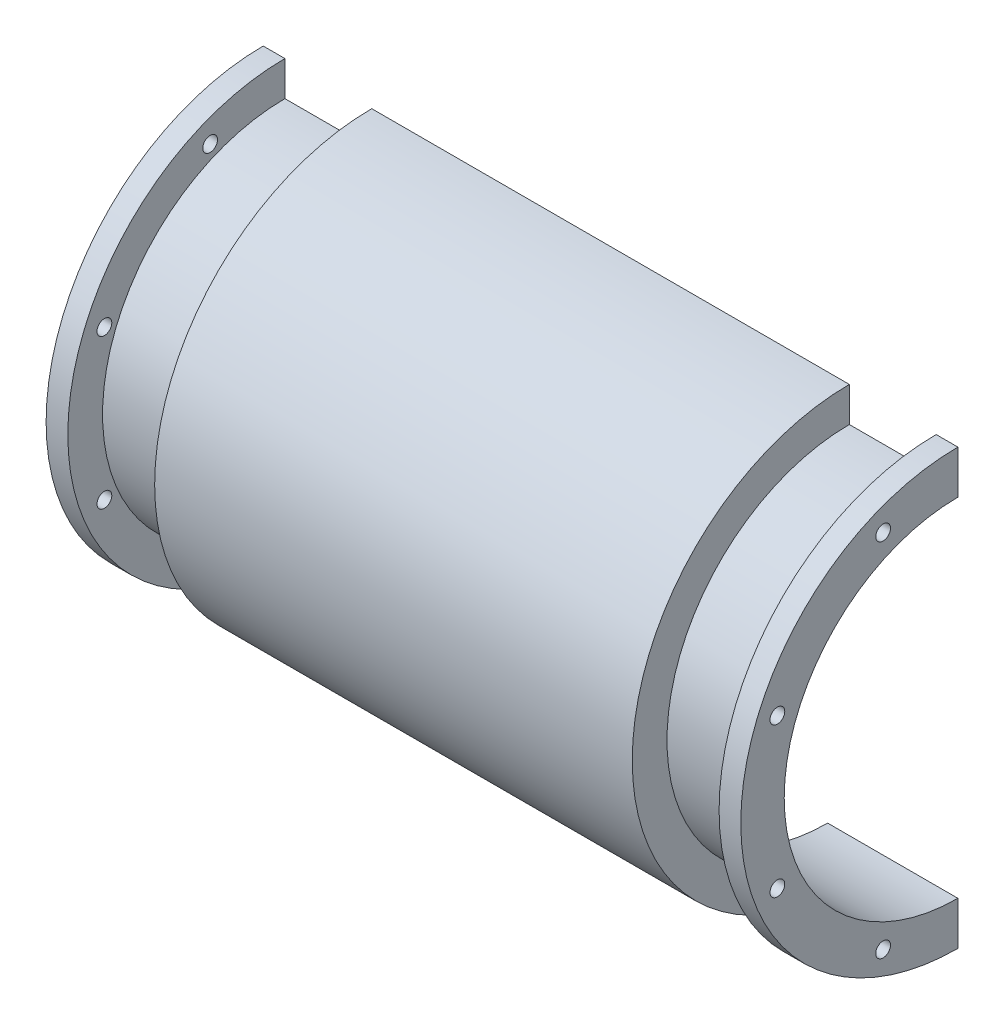
ISO-10303-21;
HEADER;
FILE_DESCRIPTION(('STEP AP214'),'2;1');
FILE_NAME('part.step','',(''),(''),'','','');
FILE_SCHEMA(('AUTOMOTIVE_DESIGN { 1 0 10303 214 1 1 1 1 }'));
ENDSEC;
DATA;
#1=APPLICATION_CONTEXT('core data for automotive mechanical design processes');
#2=APPLICATION_PROTOCOL_DEFINITION('international standard','automotive_design',2000,#1);
#3=PRODUCT_CONTEXT('',#1,'mechanical');
#4=PRODUCT('Part','Part','',(#3));
#5=PRODUCT_RELATED_PRODUCT_CATEGORY('part','',(#4));
#6=PRODUCT_DEFINITION_FORMATION('','',#4);
#7=PRODUCT_DEFINITION_CONTEXT('part definition',#1,'design');
#8=PRODUCT_DEFINITION('design','',#6,#7);
#9=PRODUCT_DEFINITION_SHAPE('','',#8);
#10=(LENGTH_UNIT() NAMED_UNIT(*) SI_UNIT(.MILLI.,.METRE.));
#11=(NAMED_UNIT(*) PLANE_ANGLE_UNIT() SI_UNIT($,.RADIAN.));
#12=(NAMED_UNIT(*) SI_UNIT($,.STERADIAN.) SOLID_ANGLE_UNIT());
#13=UNCERTAINTY_MEASURE_WITH_UNIT(LENGTH_MEASURE(1.E-05),#10,'distance_accuracy_value','');
#14=(GEOMETRIC_REPRESENTATION_CONTEXT(3) GLOBAL_UNCERTAINTY_ASSIGNED_CONTEXT((#13)) GLOBAL_UNIT_ASSIGNED_CONTEXT((#10,
#11,#12)) REPRESENTATION_CONTEXT('',''));
#15=CARTESIAN_POINT('',(0.,0.,0.));
#16=DIRECTION('',(0.,0.,1.));
#17=DIRECTION('',(1.,0.,0.));
#18=AXIS2_PLACEMENT_3D('',#15,#16,#17);
#19=CARTESIAN_POINT('',(80.,-40.,-2.79318507107451E-13));
#20=DIRECTION('',(-1.,0.,0.));
#21=DIRECTION('',(0.,-1.,0.));
#22=AXIS2_PLACEMENT_3D('',#19,#20,#21);
#23=PLANE('',#22);
#24=CARTESIAN_POINT('',(80.,41.5745789630079,17.2207544564291));
#25=DIRECTION('',(1.,0.,0.));
#26=DIRECTION('',(0.,0.,-1.));
#27=AXIS2_PLACEMENT_3D('',#24,#25,#26);
#28=CIRCLE('',#27,1.69999999999999);
#29=CARTESIAN_POINT('',(80.,41.5745789630079,15.5207544564291));
#30=VERTEX_POINT('',#29);
#31=EDGE_CURVE('E582',#30,#30,#28,.T.);
#32=ORIENTED_EDGE('',*,*,#31,.F.);
#33=EDGE_LOOP('',(#32));
#34=FACE_BOUND('',#33,.T.);
#35=CARTESIAN_POINT('',(80.,17.2207544564289,41.5745789630079));
#36=DIRECTION('',(1.,0.,0.));
#37=DIRECTION('',(0.,0.,-1.));
#38=AXIS2_PLACEMENT_3D('',#35,#36,#37);
#39=CIRCLE('',#38,1.69999999999999);
#40=CARTESIAN_POINT('',(80.,17.2207544564289,39.874578963008));
#41=VERTEX_POINT('',#40);
#42=EDGE_CURVE('E534',#41,#41,#39,.T.);
#43=ORIENTED_EDGE('',*,*,#42,.F.);
#44=EDGE_LOOP('',(#43));
#45=FACE_BOUND('',#44,.T.);
#46=CARTESIAN_POINT('',(80.,0.,0.));
#47=DIRECTION('',(-1.,0.,0.));
#48=DIRECTION('',(0.,-1.,0.));
#49=AXIS2_PLACEMENT_3D('',#46,#47,#48);
#50=CIRCLE('',#49,50.);
#51=CARTESIAN_POINT('',(80.,-50.,-3.49148133884313E-13));
#52=VERTEX_POINT('',#51);
#53=CARTESIAN_POINT('',(80.,50.,0.));
#54=VERTEX_POINT('',#53);
#55=EDGE_CURVE('E268',#52,#54,#50,.T.);
#56=ORIENTED_EDGE('',*,*,#55,.F.);
#57=DIRECTION('',(0.,-1.,0.));
#58=VECTOR('',#57,1.);
#59=CARTESIAN_POINT('',(80.,-40.,-2.79318507107451E-13));
#60=LINE('',#59,#58);
#61=CARTESIAN_POINT('',(80.,-40.,-2.79318507107451E-13));
#62=VERTEX_POINT('',#61);
#63=EDGE_CURVE('E221',#62,#52,#60,.T.);
#64=ORIENTED_EDGE('',*,*,#63,.F.);
#65=CARTESIAN_POINT('',(80.,0.,0.));
#66=DIRECTION('',(-1.,0.,0.));
#67=DIRECTION('',(0.,-1.,0.));
#68=AXIS2_PLACEMENT_3D('',#65,#66,#67);
#69=CIRCLE('',#68,40.);
#70=CARTESIAN_POINT('',(80.,40.,0.));
#71=VERTEX_POINT('',#70);
#72=EDGE_CURVE('E270',#62,#71,#69,.T.);
#73=ORIENTED_EDGE('',*,*,#72,.T.);
#74=DIRECTION('',(0.,1.,0.));
#75=VECTOR('',#74,1.);
#76=CARTESIAN_POINT('',(80.,40.,0.));
#77=LINE('',#76,#75);
#78=EDGE_CURVE('E183',#71,#54,#77,.T.);
#79=ORIENTED_EDGE('',*,*,#78,.T.);
#80=EDGE_LOOP('',(#56,#64,#73,#79));
#81=FACE_BOUND('',#80,.T.);
#82=CARTESIAN_POINT('',(80.,-41.574578963008,17.2207544564288));
#83=DIRECTION('',(1.,0.,0.));
#84=DIRECTION('',(0.,0.,-1.));
#85=AXIS2_PLACEMENT_3D('',#82,#83,#84);
#86=CIRCLE('',#85,1.69999999999999);
#87=CARTESIAN_POINT('',(80.,-41.574578963008,15.5207544564288));
#88=VERTEX_POINT('',#87);
#89=EDGE_CURVE('E527',#88,#88,#86,.T.);
#90=ORIENTED_EDGE('',*,*,#89,.F.);
#91=EDGE_LOOP('',(#90));
#92=FACE_BOUND('',#91,.T.);
#93=CARTESIAN_POINT('',(80.,-17.2207544564292,41.5745789630078));
#94=DIRECTION('',(1.,0.,0.));
#95=DIRECTION('',(0.,0.,-1.));
#96=AXIS2_PLACEMENT_3D('',#93,#94,#95);
#97=CIRCLE('',#96,1.69999999999999);
#98=CARTESIAN_POINT('',(80.,-17.2207544564292,39.8745789630078));
#99=VERTEX_POINT('',#98);
#100=EDGE_CURVE('E530',#99,#99,#97,.T.);
#101=ORIENTED_EDGE('',*,*,#100,.F.);
#102=EDGE_LOOP('',(#101));
#103=FACE_BOUND('',#102,.T.);
#104=ADVANCED_FACE('F39',(#34,#45,#81,#92,#103),#23,.F.);
#105=CARTESIAN_POINT('',(-80.,-50.,-3.49148133884313E-13));
#106=DIRECTION('',(1.,0.,0.));
#107=DIRECTION('',(0.,1.,0.));
#108=AXIS2_PLACEMENT_3D('',#105,#106,#107);
#109=PLANE('',#108);
#110=CARTESIAN_POINT('',(-80.,17.2207544564289,41.5745789630079));
#111=DIRECTION('',(-1.,0.,0.));
#112=DIRECTION('',(0.,0.,1.));
#113=AXIS2_PLACEMENT_3D('',#110,#111,#112);
#114=CIRCLE('',#113,1.69999999999999);
#115=CARTESIAN_POINT('',(-80.,17.2207544564289,43.2745789630079));
#116=VERTEX_POINT('',#115);
#117=EDGE_CURVE('E546',#116,#116,#114,.T.);
#118=ORIENTED_EDGE('',*,*,#117,.F.);
#119=EDGE_LOOP('',(#118));
#120=FACE_BOUND('',#119,.T.);
#121=CARTESIAN_POINT('',(-80.,-41.574578963008,17.2207544564288));
#122=DIRECTION('',(-1.,0.,0.));
#123=DIRECTION('',(0.,0.,1.));
#124=AXIS2_PLACEMENT_3D('',#121,#122,#123);
#125=CIRCLE('',#124,1.69999999999999);
#126=CARTESIAN_POINT('',(-80.,-41.574578963008,18.9207544564288));
#127=VERTEX_POINT('',#126);
#128=EDGE_CURVE('E558',#127,#127,#125,.T.);
#129=ORIENTED_EDGE('',*,*,#128,.F.);
#130=EDGE_LOOP('',(#129));
#131=FACE_BOUND('',#130,.T.);
#132=CARTESIAN_POINT('',(-80.,0.,0.));
#133=DIRECTION('',(-1.,0.,0.));
#134=DIRECTION('',(0.,-1.,0.));
#135=AXIS2_PLACEMENT_3D('',#132,#133,#134);
#136=CIRCLE('',#135,40.);
#137=CARTESIAN_POINT('',(-80.,-40.,-2.79318507107451E-13));
#138=VERTEX_POINT('',#137);
#139=CARTESIAN_POINT('',(-80.,40.,0.));
#140=VERTEX_POINT('',#139);
#141=EDGE_CURVE('E152',#138,#140,#136,.T.);
#142=ORIENTED_EDGE('',*,*,#141,.F.);
#143=DIRECTION('',(0.,1.,0.));
#144=VECTOR('',#143,1.);
#145=CARTESIAN_POINT('',(-80.,-50.,-3.49148133884313E-13));
#146=LINE('',#145,#144);
#147=CARTESIAN_POINT('',(-80.,-50.,-3.49148133884313E-13));
#148=VERTEX_POINT('',#147);
#149=EDGE_CURVE('E212',#148,#138,#146,.T.);
#150=ORIENTED_EDGE('',*,*,#149,.F.);
#151=CARTESIAN_POINT('',(-80.,0.,0.));
#152=DIRECTION('',(-1.,0.,0.));
#153=DIRECTION('',(0.,-1.,0.));
#154=AXIS2_PLACEMENT_3D('',#151,#152,#153);
#155=CIRCLE('',#154,50.);
#156=CARTESIAN_POINT('',(-80.,50.,0.));
#157=VERTEX_POINT('',#156);
#158=EDGE_CURVE('E169',#148,#157,#155,.T.);
#159=ORIENTED_EDGE('',*,*,#158,.T.);
#160=DIRECTION('',(0.,-1.,0.));
#161=VECTOR('',#160,1.);
#162=CARTESIAN_POINT('',(-80.,50.,0.));
#163=LINE('',#162,#161);
#164=EDGE_CURVE('E166',#157,#140,#163,.T.);
#165=ORIENTED_EDGE('',*,*,#164,.T.);
#166=EDGE_LOOP('',(#142,#150,#159,#165));
#167=FACE_BOUND('',#166,.T.);
#168=CARTESIAN_POINT('',(-80.,-17.2207544564292,41.5745789630078));
#169=DIRECTION('',(-1.,0.,0.));
#170=DIRECTION('',(0.,0.,1.));
#171=AXIS2_PLACEMENT_3D('',#168,#169,#170);
#172=CIRCLE('',#171,1.69999999999999);
#173=CARTESIAN_POINT('',(-80.,-17.2207544564292,43.2745789630078));
#174=VERTEX_POINT('',#173);
#175=EDGE_CURVE('E552',#174,#174,#172,.T.);
#176=ORIENTED_EDGE('',*,*,#175,.F.);
#177=EDGE_LOOP('',(#176));
#178=FACE_BOUND('',#177,.T.);
#179=CARTESIAN_POINT('',(-80.,41.5745789630079,17.2207544564291));
#180=DIRECTION('',(-1.,0.,0.));
#181=DIRECTION('',(0.,0.,1.));
#182=AXIS2_PLACEMENT_3D('',#179,#180,#181);
#183=CIRCLE('',#182,1.69999999999999);
#184=CARTESIAN_POINT('',(-80.,41.5745789630079,18.9207544564291));
#185=VERTEX_POINT('',#184);
#186=EDGE_CURVE('E540',#185,#185,#183,.T.);
#187=ORIENTED_EDGE('',*,*,#186,.F.);
#188=EDGE_LOOP('',(#187));
#189=FACE_BOUND('',#188,.T.);
#190=ADVANCED_FACE('F167',(#120,#131,#167,#178,#189),#109,.F.);
#191=CARTESIAN_POINT('',(-50.,0.,0.));
#192=DIRECTION('',(-1.,0.,0.));
#193=DIRECTION('',(0.,-1.,0.));
#194=AXIS2_PLACEMENT_3D('',#191,#192,#193);
#195=CYLINDRICAL_SURFACE('',#194,40.);
#196=CARTESIAN_POINT('',(-50.,0.,0.));
#197=DIRECTION('',(-1.,0.,0.));
#198=DIRECTION('',(0.,-1.,0.));
#199=AXIS2_PLACEMENT_3D('',#196,#197,#198);
#200=CIRCLE('',#199,40.);
#201=CARTESIAN_POINT('',(-50.,-40.,-2.79318507107451E-13));
#202=VERTEX_POINT('',#201);
#203=CARTESIAN_POINT('',(-50.,40.,0.));
#204=VERTEX_POINT('',#203);
#205=EDGE_CURVE('E163',#202,#204,#200,.T.);
#206=ORIENTED_EDGE('',*,*,#205,.F.);
#207=DIRECTION('',(1.,0.,0.));
#208=VECTOR('',#207,1.);
#209=CARTESIAN_POINT('',(-80.,-40.,-2.79318507107451E-13));
#210=LINE('',#209,#208);
#211=EDGE_CURVE('E158',#138,#202,#210,.T.);
#212=ORIENTED_EDGE('',*,*,#211,.F.);
#213=ORIENTED_EDGE('',*,*,#141,.T.);
#214=DIRECTION('',(1.,0.,0.));
#215=VECTOR('',#214,1.);
#216=CARTESIAN_POINT('',(-80.,40.,0.));
#217=LINE('',#216,#215);
#218=EDGE_CURVE('E156',#140,#204,#217,.T.);
#219=ORIENTED_EDGE('',*,*,#218,.T.);
#220=EDGE_LOOP('',(#206,#212,#213,#219));
#221=FACE_BOUND('',#220,.T.);
#222=ADVANCED_FACE('F154',(#221),#195,.F.);
#223=CARTESIAN_POINT('',(-50.,0.,0.));
#224=DIRECTION('',(-1.,0.,0.));
#225=DIRECTION('',(0.,-1.,0.));
#226=AXIS2_PLACEMENT_3D('',#223,#224,#225);
#227=CYLINDRICAL_SURFACE('',#226,49.);
#228=DIRECTION('',(1.,0.,0.));
#229=VECTOR('',#228,1.);
#230=CARTESIAN_POINT('',(-50.,-49.,-3.42165171206627E-13));
#231=LINE('',#230,#229);
#232=CARTESIAN_POINT('',(-41.,-49.,-3.42165171206627E-13));
#233=VERTEX_POINT('',#232);
#234=CARTESIAN_POINT('',(41.,-49.,-3.42165171206627E-13));
#235=VERTEX_POINT('',#234);
#236=EDGE_CURVE('E215',#233,#235,#231,.T.);
#237=ORIENTED_EDGE('',*,*,#236,.F.);
#238=CARTESIAN_POINT('',(-41.,0.,0.));
#239=DIRECTION('',(-1.,0.,0.));
#240=DIRECTION('',(0.,-1.,0.));
#241=AXIS2_PLACEMENT_3D('',#238,#239,#240);
#242=CIRCLE('',#241,49.);
#243=CARTESIAN_POINT('',(-41.,49.,0.));
#244=VERTEX_POINT('',#243);
#245=EDGE_CURVE('E277',#233,#244,#242,.T.);
#246=ORIENTED_EDGE('',*,*,#245,.T.);
#247=DIRECTION('',(1.,0.,0.));
#248=VECTOR('',#247,1.);
#249=CARTESIAN_POINT('',(-50.,49.,0.));
#250=LINE('',#249,#248);
#251=CARTESIAN_POINT('',(41.,49.,0.));
#252=VERTEX_POINT('',#251);
#253=EDGE_CURVE('E175',#244,#252,#250,.T.);
#254=ORIENTED_EDGE('',*,*,#253,.T.);
#255=CARTESIAN_POINT('',(41.,0.,0.));
#256=DIRECTION('',(1.,0.,0.));
#257=DIRECTION('',(0.,1.,0.));
#258=AXIS2_PLACEMENT_3D('',#255,#256,#257);
#259=CIRCLE('',#258,49.);
#260=EDGE_CURVE('E162',#252,#235,#259,.T.);
#261=ORIENTED_EDGE('',*,*,#260,.T.);
#262=EDGE_LOOP('',(#237,#246,#254,#261));
#263=FACE_BOUND('',#262,.T.);
#264=ADVANCED_FACE('F287',(#263),#227,.F.);
#265=CARTESIAN_POINT('',(-50.,0.,0.));
#266=DIRECTION('',(-1.,0.,0.));
#267=DIRECTION('',(0.,-1.,0.));
#268=AXIS2_PLACEMENT_3D('',#265,#266,#267);
#269=CYLINDRICAL_SURFACE('',#268,40.);
#270=ORIENTED_EDGE('',*,*,#72,.F.);
#271=DIRECTION('',(1.,0.,0.));
#272=VECTOR('',#271,1.);
#273=CARTESIAN_POINT('',(50.,-40.,-2.79318507107451E-13));
#274=LINE('',#273,#272);
#275=CARTESIAN_POINT('',(50.,-40.,-2.79318507107451E-13));
#276=VERTEX_POINT('',#275);
#277=EDGE_CURVE('E218',#276,#62,#274,.T.);
#278=ORIENTED_EDGE('',*,*,#277,.F.);
#279=CARTESIAN_POINT('',(50.,0.,0.));
#280=DIRECTION('',(-1.,0.,0.));
#281=DIRECTION('',(0.,-1.,0.));
#282=AXIS2_PLACEMENT_3D('',#279,#280,#281);
#283=CIRCLE('',#282,40.);
#284=CARTESIAN_POINT('',(50.,40.,0.));
#285=VERTEX_POINT('',#284);
#286=EDGE_CURVE('E272',#276,#285,#283,.T.);
#287=ORIENTED_EDGE('',*,*,#286,.T.);
#288=DIRECTION('',(1.,0.,0.));
#289=VECTOR('',#288,1.);
#290=CARTESIAN_POINT('',(50.,40.,0.));
#291=LINE('',#290,#289);
#292=EDGE_CURVE('E177',#285,#71,#291,.T.);
#293=ORIENTED_EDGE('',*,*,#292,.T.);
#294=EDGE_LOOP('',(#270,#278,#287,#293));
#295=FACE_BOUND('',#294,.T.);
#296=ADVANCED_FACE('F318',(#295),#269,.F.);
#297=CARTESIAN_POINT('',(-50.,0.,0.));
#298=DIRECTION('',(-1.,0.,0.));
#299=DIRECTION('',(0.,-1.,0.));
#300=AXIS2_PLACEMENT_3D('',#297,#298,#299);
#301=CYLINDRICAL_SURFACE('',#300,50.);
#302=CARTESIAN_POINT('',(75.,0.,0.));
#303=DIRECTION('',(-1.,0.,0.));
#304=DIRECTION('',(0.,-1.,0.));
#305=AXIS2_PLACEMENT_3D('',#302,#303,#304);
#306=CIRCLE('',#305,50.);
#307=CARTESIAN_POINT('',(75.,-50.,-3.49148133884313E-13));
#308=VERTEX_POINT('',#307);
#309=CARTESIAN_POINT('',(75.,50.,0.));
#310=VERTEX_POINT('',#309);
#311=EDGE_CURVE('E266',#308,#310,#306,.T.);
#312=ORIENTED_EDGE('',*,*,#311,.F.);
#313=DIRECTION('',(-1.,0.,0.));
#314=VECTOR('',#313,1.);
#315=CARTESIAN_POINT('',(80.,-50.,-3.49148133884313E-13));
#316=LINE('',#315,#314);
#317=EDGE_CURVE('E224',#52,#308,#316,.T.);
#318=ORIENTED_EDGE('',*,*,#317,.F.);
#319=ORIENTED_EDGE('',*,*,#55,.T.);
#320=DIRECTION('',(-1.,0.,0.));
#321=VECTOR('',#320,1.);
#322=CARTESIAN_POINT('',(80.,50.,0.));
#323=LINE('',#322,#321);
#324=EDGE_CURVE('E186',#54,#310,#323,.T.);
#325=ORIENTED_EDGE('',*,*,#324,.T.);
#326=EDGE_LOOP('',(#312,#318,#319,#325));
#327=FACE_BOUND('',#326,.T.);
#328=ADVANCED_FACE('F316',(#327),#301,.T.);
#329=CARTESIAN_POINT('',(75.,-50.,-3.49148133884313E-13));
#330=DIRECTION('',(1.,0.,0.));
#331=DIRECTION('',(0.,1.,0.));
#332=AXIS2_PLACEMENT_3D('',#329,#330,#331);
#333=PLANE('',#332);
#334=CARTESIAN_POINT('',(75.,41.5745789630079,17.2207544564291));
#335=DIRECTION('',(1.,0.,0.));
#336=DIRECTION('',(0.,1.,0.));
#337=AXIS2_PLACEMENT_3D('',#334,#335,#336);
#338=CIRCLE('',#337,1.69999999999999);
#339=CARTESIAN_POINT('',(75.,43.2745789630079,17.2207544564291));
#340=VERTEX_POINT('',#339);
#341=EDGE_CURVE('E488',#340,#340,#338,.T.);
#342=ORIENTED_EDGE('',*,*,#341,.T.);
#343=EDGE_LOOP('',(#342));
#344=FACE_BOUND('',#343,.T.);
#345=CARTESIAN_POINT('',(75.,17.2207544564289,41.5745789630079));
#346=DIRECTION('',(1.,0.,0.));
#347=DIRECTION('',(0.,1.,0.));
#348=AXIS2_PLACEMENT_3D('',#345,#346,#347);
#349=CIRCLE('',#348,1.69999999999999);
#350=CARTESIAN_POINT('',(75.,18.9207544564289,41.5745789630079));
#351=VERTEX_POINT('',#350);
#352=EDGE_CURVE('E491',#351,#351,#349,.T.);
#353=ORIENTED_EDGE('',*,*,#352,.T.);
#354=EDGE_LOOP('',(#353));
#355=FACE_BOUND('',#354,.T.);
#356=CARTESIAN_POINT('',(75.,-17.2207544564292,41.5745789630078));
#357=DIRECTION('',(1.,0.,0.));
#358=DIRECTION('',(0.,1.,0.));
#359=AXIS2_PLACEMENT_3D('',#356,#357,#358);
#360=CIRCLE('',#359,1.69999999999999);
#361=CARTESIAN_POINT('',(75.,-15.5207544564292,41.5745789630078));
#362=VERTEX_POINT('',#361);
#363=EDGE_CURVE('E495',#362,#362,#360,.T.);
#364=ORIENTED_EDGE('',*,*,#363,.T.);
#365=EDGE_LOOP('',(#364));
#366=FACE_BOUND('',#365,.T.);
#367=CARTESIAN_POINT('',(75.,-41.574578963008,17.2207544564288));
#368=DIRECTION('',(1.,0.,0.));
#369=DIRECTION('',(0.,1.,0.));
#370=AXIS2_PLACEMENT_3D('',#367,#368,#369);
#371=CIRCLE('',#370,1.69999999999999);
#372=CARTESIAN_POINT('',(75.,-39.874578963008,17.2207544564288));
#373=VERTEX_POINT('',#372);
#374=EDGE_CURVE('E499',#373,#373,#371,.T.);
#375=ORIENTED_EDGE('',*,*,#374,.T.);
#376=EDGE_LOOP('',(#375));
#377=FACE_BOUND('',#376,.T.);
#378=CARTESIAN_POINT('',(75.,0.,0.));
#379=DIRECTION('',(-1.,0.,0.));
#380=DIRECTION('',(0.,-1.,0.));
#381=AXIS2_PLACEMENT_3D('',#378,#379,#380);
#382=CIRCLE('',#381,42.);
#383=CARTESIAN_POINT('',(75.,-42.,-2.93284432462823E-13));
#384=VERTEX_POINT('',#383);
#385=CARTESIAN_POINT('',(75.,42.,0.));
#386=VERTEX_POINT('',#385);
#387=EDGE_CURVE('E264',#384,#386,#382,.T.);
#388=ORIENTED_EDGE('',*,*,#387,.F.);
#389=DIRECTION('',(0.,1.,0.));
#390=VECTOR('',#389,1.);
#391=CARTESIAN_POINT('',(75.,-50.,-3.49148133884313E-13));
#392=LINE('',#391,#390);
#393=EDGE_CURVE('E227',#308,#384,#392,.T.);
#394=ORIENTED_EDGE('',*,*,#393,.F.);
#395=ORIENTED_EDGE('',*,*,#311,.T.);
#396=DIRECTION('',(0.,-1.,0.));
#397=VECTOR('',#396,1.);
#398=CARTESIAN_POINT('',(75.,50.,0.));
#399=LINE('',#398,#397);
#400=EDGE_CURVE('E189',#310,#386,#399,.T.);
#401=ORIENTED_EDGE('',*,*,#400,.T.);
#402=EDGE_LOOP('',(#388,#394,#395,#401));
#403=FACE_BOUND('',#402,.T.);
#404=ADVANCED_FACE('F478',(#344,#355,#366,#377,#403),#333,.F.);
#405=CARTESIAN_POINT('',(-50.,0.,0.));
#406=DIRECTION('',(-1.,0.,0.));
#407=DIRECTION('',(0.,-1.,0.));
#408=AXIS2_PLACEMENT_3D('',#405,#406,#407);
#409=CYLINDRICAL_SURFACE('',#408,42.);
#410=CARTESIAN_POINT('',(55.,0.,0.));
#411=DIRECTION('',(-1.,0.,0.));
#412=DIRECTION('',(0.,-1.,0.));
#413=AXIS2_PLACEMENT_3D('',#410,#411,#412);
#414=CIRCLE('',#413,42.);
#415=CARTESIAN_POINT('',(55.,-42.,-2.93284432462823E-13));
#416=VERTEX_POINT('',#415);
#417=CARTESIAN_POINT('',(55.,42.,0.));
#418=VERTEX_POINT('',#417);
#419=EDGE_CURVE('E262',#416,#418,#414,.T.);
#420=ORIENTED_EDGE('',*,*,#419,.F.);
#421=DIRECTION('',(-1.,0.,0.));
#422=VECTOR('',#421,1.);
#423=CARTESIAN_POINT('',(75.,-42.,-2.93284432462823E-13));
#424=LINE('',#423,#422);
#425=EDGE_CURVE('E230',#384,#416,#424,.T.);
#426=ORIENTED_EDGE('',*,*,#425,.F.);
#427=ORIENTED_EDGE('',*,*,#387,.T.);
#428=DIRECTION('',(-1.,0.,0.));
#429=VECTOR('',#428,1.);
#430=CARTESIAN_POINT('',(75.,42.,0.));
#431=LINE('',#430,#429);
#432=EDGE_CURVE('E192',#386,#418,#431,.T.);
#433=ORIENTED_EDGE('',*,*,#432,.T.);
#434=EDGE_LOOP('',(#420,#426,#427,#433));
#435=FACE_BOUND('',#434,.T.);
#436=ADVANCED_FACE('F475',(#435),#409,.T.);
#437=CARTESIAN_POINT('',(55.,-42.,-2.93284432462823E-13));
#438=DIRECTION('',(-1.,0.,0.));
#439=DIRECTION('',(0.,-1.,0.));
#440=AXIS2_PLACEMENT_3D('',#437,#438,#439);
#441=PLANE('',#440);
#442=CARTESIAN_POINT('',(55.,0.,0.));
#443=DIRECTION('',(-1.,0.,0.));
#444=DIRECTION('',(0.,-1.,0.));
#445=AXIS2_PLACEMENT_3D('',#442,#443,#444);
#446=CIRCLE('',#445,50.);
#447=CARTESIAN_POINT('',(55.,-50.,-3.49148133884313E-13));
#448=VERTEX_POINT('',#447);
#449=CARTESIAN_POINT('',(55.,50.,0.));
#450=VERTEX_POINT('',#449);
#451=EDGE_CURVE('E260',#448,#450,#446,.T.);
#452=ORIENTED_EDGE('',*,*,#451,.F.);
#453=DIRECTION('',(0.,-1.,0.));
#454=VECTOR('',#453,1.);
#455=CARTESIAN_POINT('',(55.,-42.,-2.93284432462823E-13));
#456=LINE('',#455,#454);
#457=EDGE_CURVE('E233',#416,#448,#456,.T.);
#458=ORIENTED_EDGE('',*,*,#457,.F.);
#459=ORIENTED_EDGE('',*,*,#419,.T.);
#460=DIRECTION('',(0.,1.,0.));
#461=VECTOR('',#460,1.);
#462=CARTESIAN_POINT('',(55.,42.,0.));
#463=LINE('',#462,#461);
#464=EDGE_CURVE('E195',#418,#450,#463,.T.);
#465=ORIENTED_EDGE('',*,*,#464,.T.);
#466=EDGE_LOOP('',(#452,#458,#459,#465));
#467=FACE_BOUND('',#466,.T.);
#468=ADVANCED_FACE('F471',(#467),#441,.F.);
#469=CARTESIAN_POINT('',(-50.,0.,0.));
#470=DIRECTION('',(-1.,0.,0.));
#471=DIRECTION('',(0.,-1.,0.));
#472=AXIS2_PLACEMENT_3D('',#469,#470,#471);
#473=CYLINDRICAL_SURFACE('',#472,50.);
#474=CARTESIAN_POINT('',(-55.,0.,0.));
#475=DIRECTION('',(-1.,0.,0.));
#476=DIRECTION('',(0.,-1.,0.));
#477=AXIS2_PLACEMENT_3D('',#474,#475,#476);
#478=CIRCLE('',#477,50.);
#479=CARTESIAN_POINT('',(-55.,-50.,-3.49148133884313E-13));
#480=VERTEX_POINT('',#479);
#481=CARTESIAN_POINT('',(-55.,50.,0.));
#482=VERTEX_POINT('',#481);
#483=EDGE_CURVE('E258',#480,#482,#478,.T.);
#484=ORIENTED_EDGE('',*,*,#483,.F.);
#485=DIRECTION('',(-1.,0.,0.));
#486=VECTOR('',#485,1.);
#487=CARTESIAN_POINT('',(55.,-50.,-3.49148133884313E-13));
#488=LINE('',#487,#486);
#489=EDGE_CURVE('E236',#448,#480,#488,.T.);
#490=ORIENTED_EDGE('',*,*,#489,.F.);
#491=ORIENTED_EDGE('',*,*,#451,.T.);
#492=DIRECTION('',(-1.,0.,0.));
#493=VECTOR('',#492,1.);
#494=CARTESIAN_POINT('',(55.,50.,0.));
#495=LINE('',#494,#493);
#496=EDGE_CURVE('E198',#450,#482,#495,.T.);
#497=ORIENTED_EDGE('',*,*,#496,.T.);
#498=EDGE_LOOP('',(#484,#490,#491,#497));
#499=FACE_BOUND('',#498,.T.);
#500=ADVANCED_FACE('F467',(#499),#473,.T.);
#501=CARTESIAN_POINT('',(-55.,-50.,-3.49148133884313E-13));
#502=DIRECTION('',(1.,0.,0.));
#503=DIRECTION('',(0.,1.,0.));
#504=AXIS2_PLACEMENT_3D('',#501,#502,#503);
#505=PLANE('',#504);
#506=CARTESIAN_POINT('',(-55.,0.,0.));
#507=DIRECTION('',(-1.,0.,0.));
#508=DIRECTION('',(0.,-1.,0.));
#509=AXIS2_PLACEMENT_3D('',#506,#507,#508);
#510=CIRCLE('',#509,42.);
#511=CARTESIAN_POINT('',(-55.,-42.,-2.93284432462823E-13));
#512=VERTEX_POINT('',#511);
#513=CARTESIAN_POINT('',(-55.,42.,0.));
#514=VERTEX_POINT('',#513);
#515=EDGE_CURVE('E256',#512,#514,#510,.T.);
#516=ORIENTED_EDGE('',*,*,#515,.F.);
#517=DIRECTION('',(0.,1.,0.));
#518=VECTOR('',#517,1.);
#519=CARTESIAN_POINT('',(-55.,-50.,-3.49148133884313E-13));
#520=LINE('',#519,#518);
#521=EDGE_CURVE('E239',#480,#512,#520,.T.);
#522=ORIENTED_EDGE('',*,*,#521,.F.);
#523=ORIENTED_EDGE('',*,*,#483,.T.);
#524=DIRECTION('',(0.,-1.,0.));
#525=VECTOR('',#524,1.);
#526=CARTESIAN_POINT('',(-55.,50.,0.));
#527=LINE('',#526,#525);
#528=EDGE_CURVE('E201',#482,#514,#527,.T.);
#529=ORIENTED_EDGE('',*,*,#528,.T.);
#530=EDGE_LOOP('',(#516,#522,#523,#529));
#531=FACE_BOUND('',#530,.T.);
#532=ADVANCED_FACE('F463',(#531),#505,.F.);
#533=CARTESIAN_POINT('',(-50.,0.,0.));
#534=DIRECTION('',(-1.,0.,0.));
#535=DIRECTION('',(0.,-1.,0.));
#536=AXIS2_PLACEMENT_3D('',#533,#534,#535);
#537=CYLINDRICAL_SURFACE('',#536,42.);
#538=CARTESIAN_POINT('',(-75.,0.,0.));
#539=DIRECTION('',(-1.,0.,0.));
#540=DIRECTION('',(0.,-1.,0.));
#541=AXIS2_PLACEMENT_3D('',#538,#539,#540);
#542=CIRCLE('',#541,42.);
#543=CARTESIAN_POINT('',(-75.,-42.,-2.93284432462823E-13));
#544=VERTEX_POINT('',#543);
#545=CARTESIAN_POINT('',(-75.,42.,0.));
#546=VERTEX_POINT('',#545);
#547=EDGE_CURVE('E254',#544,#546,#542,.T.);
#548=ORIENTED_EDGE('',*,*,#547,.F.);
#549=DIRECTION('',(-1.,0.,0.));
#550=VECTOR('',#549,1.);
#551=CARTESIAN_POINT('',(-55.,-42.,-2.93284432462823E-13));
#552=LINE('',#551,#550);
#553=EDGE_CURVE('E242',#512,#544,#552,.T.);
#554=ORIENTED_EDGE('',*,*,#553,.F.);
#555=ORIENTED_EDGE('',*,*,#515,.T.);
#556=DIRECTION('',(-1.,0.,0.));
#557=VECTOR('',#556,1.);
#558=CARTESIAN_POINT('',(-55.,42.,0.));
#559=LINE('',#558,#557);
#560=EDGE_CURVE('E204',#514,#546,#559,.T.);
#561=ORIENTED_EDGE('',*,*,#560,.T.);
#562=EDGE_LOOP('',(#548,#554,#555,#561));
#563=FACE_BOUND('',#562,.T.);
#564=ADVANCED_FACE('F459',(#563),#537,.T.);
#565=CARTESIAN_POINT('',(-75.,-42.,-2.93284432462823E-13));
#566=DIRECTION('',(-1.,0.,0.));
#567=DIRECTION('',(0.,-1.,0.));
#568=AXIS2_PLACEMENT_3D('',#565,#566,#567);
#569=PLANE('',#568);
#570=CARTESIAN_POINT('',(-75.,41.5745789630079,17.2207544564291));
#571=DIRECTION('',(-1.,0.,0.));
#572=DIRECTION('',(0.,-1.,0.));
#573=AXIS2_PLACEMENT_3D('',#570,#571,#572);
#574=CIRCLE('',#573,1.69999999999999);
#575=CARTESIAN_POINT('',(-75.,39.8745789630079,17.2207544564291));
#576=VERTEX_POINT('',#575);
#577=EDGE_CURVE('E543',#576,#576,#574,.T.);
#578=ORIENTED_EDGE('',*,*,#577,.T.);
#579=EDGE_LOOP('',(#578));
#580=FACE_BOUND('',#579,.T.);
#581=CARTESIAN_POINT('',(-75.,17.2207544564289,41.5745789630079));
#582=DIRECTION('',(-1.,0.,0.));
#583=DIRECTION('',(0.,-1.,0.));
#584=AXIS2_PLACEMENT_3D('',#581,#582,#583);
#585=CIRCLE('',#584,1.69999999999999);
#586=CARTESIAN_POINT('',(-75.,15.5207544564289,41.5745789630079));
#587=VERTEX_POINT('',#586);
#588=EDGE_CURVE('E549',#587,#587,#585,.T.);
#589=ORIENTED_EDGE('',*,*,#588,.T.);
#590=EDGE_LOOP('',(#589));
#591=FACE_BOUND('',#590,.T.);
#592=CARTESIAN_POINT('',(-75.,-17.2207544564292,41.5745789630078));
#593=DIRECTION('',(-1.,0.,0.));
#594=DIRECTION('',(0.,-1.,0.));
#595=AXIS2_PLACEMENT_3D('',#592,#593,#594);
#596=CIRCLE('',#595,1.69999999999999);
#597=CARTESIAN_POINT('',(-75.,-18.9207544564292,41.5745789630078));
#598=VERTEX_POINT('',#597);
#599=EDGE_CURVE('E555',#598,#598,#596,.T.);
#600=ORIENTED_EDGE('',*,*,#599,.T.);
#601=EDGE_LOOP('',(#600));
#602=FACE_BOUND('',#601,.T.);
#603=CARTESIAN_POINT('',(-75.,-41.574578963008,17.2207544564288));
#604=DIRECTION('',(-1.,0.,0.));
#605=DIRECTION('',(0.,-1.,0.));
#606=AXIS2_PLACEMENT_3D('',#603,#604,#605);
#607=CIRCLE('',#606,1.69999999999999);
#608=CARTESIAN_POINT('',(-75.,-43.274578963008,17.2207544564288));
#609=VERTEX_POINT('',#608);
#610=EDGE_CURVE('E172',#609,#609,#607,.T.);
#611=ORIENTED_EDGE('',*,*,#610,.T.);
#612=EDGE_LOOP('',(#611));
#613=FACE_BOUND('',#612,.T.);
#614=CARTESIAN_POINT('',(-75.,0.,0.));
#615=DIRECTION('',(-1.,0.,0.));
#616=DIRECTION('',(0.,-1.,0.));
#617=AXIS2_PLACEMENT_3D('',#614,#615,#616);
#618=CIRCLE('',#617,50.);
#619=CARTESIAN_POINT('',(-75.,-50.,-3.49148133884313E-13));
#620=VERTEX_POINT('',#619);
#621=CARTESIAN_POINT('',(-75.,50.,0.));
#622=VERTEX_POINT('',#621);
#623=EDGE_CURVE('E252',#620,#622,#618,.T.);
#624=ORIENTED_EDGE('',*,*,#623,.F.);
#625=DIRECTION('',(0.,-1.,0.));
#626=VECTOR('',#625,1.);
#627=CARTESIAN_POINT('',(-75.,-42.,-2.93284432462823E-13));
#628=LINE('',#627,#626);
#629=EDGE_CURVE('E245',#544,#620,#628,.T.);
#630=ORIENTED_EDGE('',*,*,#629,.F.);
#631=ORIENTED_EDGE('',*,*,#547,.T.);
#632=DIRECTION('',(0.,1.,0.));
#633=VECTOR('',#632,1.);
#634=CARTESIAN_POINT('',(-75.,42.,0.));
#635=LINE('',#634,#633);
#636=EDGE_CURVE('E207',#546,#622,#635,.T.);
#637=ORIENTED_EDGE('',*,*,#636,.T.);
#638=EDGE_LOOP('',(#624,#630,#631,#637));
#639=FACE_BOUND('',#638,.T.);
#640=ADVANCED_FACE('F456',(#580,#591,#602,#613,#639),#569,.F.);
#641=CARTESIAN_POINT('',(-50.,0.,0.));
#642=DIRECTION('',(-1.,0.,0.));
#643=DIRECTION('',(0.,-1.,0.));
#644=AXIS2_PLACEMENT_3D('',#641,#642,#643);
#645=CYLINDRICAL_SURFACE('',#644,50.);
#646=DIRECTION('',(-1.,0.,0.));
#647=VECTOR('',#646,1.);
#648=CARTESIAN_POINT('',(-75.,-50.,-3.49148133884313E-13));
#649=LINE('',#648,#647);
#650=EDGE_CURVE('E248',#620,#148,#649,.T.);
#651=ORIENTED_EDGE('',*,*,#650,.F.);
#652=ORIENTED_EDGE('',*,*,#623,.T.);
#653=DIRECTION('',(-1.,0.,0.));
#654=VECTOR('',#653,1.);
#655=CARTESIAN_POINT('',(-75.,50.,0.));
#656=LINE('',#655,#654);
#657=EDGE_CURVE('E210',#622,#157,#656,.T.);
#658=ORIENTED_EDGE('',*,*,#657,.T.);
#659=ORIENTED_EDGE('',*,*,#158,.F.);
#660=EDGE_LOOP('',(#651,#652,#658,#659));
#661=FACE_BOUND('',#660,.T.);
#662=ADVANCED_FACE('F346',(#661),#645,.T.);
#663=CARTESIAN_POINT('',(0.,0.,0.));
#664=DIRECTION('',(0.,0.,-1.));
#665=DIRECTION('',(1.,0.,0.));
#666=AXIS2_PLACEMENT_3D('',#663,#664,#665);
#667=PLANE('',#666);
#668=ORIENTED_EDGE('',*,*,#149,.T.);
#669=ORIENTED_EDGE('',*,*,#211,.T.);
#670=CARTESIAN_POINT('',(-41.,-40.,-2.79318507107451E-13));
#671=DIRECTION('',(0.,0.,-1.));
#672=DIRECTION('',(0.,1.,0.));
#673=AXIS2_PLACEMENT_3D('',#670,#671,#672);
#674=CIRCLE('',#673,9.);
#675=EDGE_CURVE('E280',#202,#233,#674,.F.);
#676=ORIENTED_EDGE('',*,*,#675,.T.);
#677=ORIENTED_EDGE('',*,*,#236,.T.);
#678=CARTESIAN_POINT('',(41.,-40.,-2.79318507107451E-13));
#679=DIRECTION('',(0.,0.,-1.));
#680=DIRECTION('',(0.,1.,0.));
#681=AXIS2_PLACEMENT_3D('',#678,#679,#680);
#682=CIRCLE('',#681,9.);
#683=EDGE_CURVE('E11',#235,#276,#682,.F.);
#684=ORIENTED_EDGE('',*,*,#683,.T.);
#685=ORIENTED_EDGE('',*,*,#277,.T.);
#686=ORIENTED_EDGE('',*,*,#63,.T.);
#687=ORIENTED_EDGE('',*,*,#317,.T.);
#688=ORIENTED_EDGE('',*,*,#393,.T.);
#689=ORIENTED_EDGE('',*,*,#425,.T.);
#690=ORIENTED_EDGE('',*,*,#457,.T.);
#691=ORIENTED_EDGE('',*,*,#489,.T.);
#692=ORIENTED_EDGE('',*,*,#521,.T.);
#693=ORIENTED_EDGE('',*,*,#553,.T.);
#694=ORIENTED_EDGE('',*,*,#629,.T.);
#695=ORIENTED_EDGE('',*,*,#650,.T.);
#696=EDGE_LOOP('',(#668,#669,#676,#677,#684,#685,#686,#687,#688,#689,#690,#691,#692,#693,#694,#695));
#697=FACE_BOUND('',#696,.T.);
#698=ADVANCED_FACE('F284',(#697),#667,.T.);
#699=CARTESIAN_POINT('',(0.,0.,0.));
#700=DIRECTION('',(0.,0.,1.));
#701=DIRECTION('',(1.,0.,0.));
#702=AXIS2_PLACEMENT_3D('',#699,#700,#701);
#703=PLANE('',#702);
#704=ORIENTED_EDGE('',*,*,#164,.F.);
#705=ORIENTED_EDGE('',*,*,#657,.F.);
#706=ORIENTED_EDGE('',*,*,#636,.F.);
#707=ORIENTED_EDGE('',*,*,#560,.F.);
#708=ORIENTED_EDGE('',*,*,#528,.F.);
#709=ORIENTED_EDGE('',*,*,#496,.F.);
#710=ORIENTED_EDGE('',*,*,#464,.F.);
#711=ORIENTED_EDGE('',*,*,#432,.F.);
#712=ORIENTED_EDGE('',*,*,#400,.F.);
#713=ORIENTED_EDGE('',*,*,#324,.F.);
#714=ORIENTED_EDGE('',*,*,#78,.F.);
#715=ORIENTED_EDGE('',*,*,#292,.F.);
#716=CARTESIAN_POINT('',(41.,40.,0.));
#717=DIRECTION('',(0.,0.,1.));
#718=DIRECTION('',(1.,0.,0.));
#719=AXIS2_PLACEMENT_3D('',#716,#717,#718);
#720=CIRCLE('',#719,9.);
#721=EDGE_CURVE('E47',#285,#252,#720,.T.);
#722=ORIENTED_EDGE('',*,*,#721,.T.);
#723=ORIENTED_EDGE('',*,*,#253,.F.);
#724=CARTESIAN_POINT('',(-41.,40.,0.));
#725=DIRECTION('',(0.,0.,1.));
#726=DIRECTION('',(1.,0.,0.));
#727=AXIS2_PLACEMENT_3D('',#724,#725,#726);
#728=CIRCLE('',#727,9.);
#729=EDGE_CURVE('E61',#244,#204,#728,.T.);
#730=ORIENTED_EDGE('',*,*,#729,.T.);
#731=ORIENTED_EDGE('',*,*,#218,.F.);
#732=EDGE_LOOP('',(#704,#705,#706,#707,#708,#709,#710,#711,#712,#713,#714,#715,#722,#723,#730,#731));
#733=FACE_BOUND('',#732,.T.);
#734=ADVANCED_FACE('F174',(#733),#703,.F.);
#735=CARTESIAN_POINT('',(-80.,-41.574578963008,17.2207544564288));
#736=DIRECTION('',(-1.,0.,0.));
#737=DIRECTION('',(0.,0.,1.));
#738=AXIS2_PLACEMENT_3D('',#735,#736,#737);
#739=CYLINDRICAL_SURFACE('',#738,1.69999999999999);
#740=ORIENTED_EDGE('',*,*,#610,.F.);
#741=EDGE_LOOP('',(#740));
#742=FACE_BOUND('',#741,.T.);
#743=ORIENTED_EDGE('',*,*,#128,.T.);
#744=EDGE_LOOP('',(#743));
#745=FACE_BOUND('',#744,.T.);
#746=ADVANCED_FACE('F354',(#742,#745),#739,.F.);
#747=CARTESIAN_POINT('',(-80.,-17.2207544564292,41.5745789630078));
#748=DIRECTION('',(-1.,0.,0.));
#749=DIRECTION('',(0.,0.,1.));
#750=AXIS2_PLACEMENT_3D('',#747,#748,#749);
#751=CYLINDRICAL_SURFACE('',#750,1.69999999999999);
#752=ORIENTED_EDGE('',*,*,#599,.F.);
#753=EDGE_LOOP('',(#752));
#754=FACE_BOUND('',#753,.T.);
#755=ORIENTED_EDGE('',*,*,#175,.T.);
#756=EDGE_LOOP('',(#755));
#757=FACE_BOUND('',#756,.T.);
#758=ADVANCED_FACE('F366',(#754,#757),#751,.F.);
#759=CARTESIAN_POINT('',(-80.,17.2207544564289,41.5745789630079));
#760=DIRECTION('',(-1.,0.,0.));
#761=DIRECTION('',(0.,0.,1.));
#762=AXIS2_PLACEMENT_3D('',#759,#760,#761);
#763=CYLINDRICAL_SURFACE('',#762,1.69999999999999);
#764=ORIENTED_EDGE('',*,*,#588,.F.);
#765=EDGE_LOOP('',(#764));
#766=FACE_BOUND('',#765,.T.);
#767=ORIENTED_EDGE('',*,*,#117,.T.);
#768=EDGE_LOOP('',(#767));
#769=FACE_BOUND('',#768,.T.);
#770=ADVANCED_FACE('F384',(#766,#769),#763,.F.);
#771=CARTESIAN_POINT('',(-80.,41.5745789630079,17.2207544564291));
#772=DIRECTION('',(-1.,0.,0.));
#773=DIRECTION('',(0.,0.,1.));
#774=AXIS2_PLACEMENT_3D('',#771,#772,#773);
#775=CYLINDRICAL_SURFACE('',#774,1.69999999999999);
#776=ORIENTED_EDGE('',*,*,#577,.F.);
#777=EDGE_LOOP('',(#776));
#778=FACE_BOUND('',#777,.T.);
#779=ORIENTED_EDGE('',*,*,#186,.T.);
#780=EDGE_LOOP('',(#779));
#781=FACE_BOUND('',#780,.T.);
#782=ADVANCED_FACE('F394',(#778,#781),#775,.F.);
#783=CARTESIAN_POINT('',(80.,-41.574578963008,17.2207544564288));
#784=DIRECTION('',(1.,0.,0.));
#785=DIRECTION('',(0.,0.,-1.));
#786=AXIS2_PLACEMENT_3D('',#783,#784,#785);
#787=CYLINDRICAL_SURFACE('',#786,1.69999999999999);
#788=ORIENTED_EDGE('',*,*,#374,.F.);
#789=EDGE_LOOP('',(#788));
#790=FACE_BOUND('',#789,.T.);
#791=ORIENTED_EDGE('',*,*,#89,.T.);
#792=EDGE_LOOP('',(#791));
#793=FACE_BOUND('',#792,.T.);
#794=ADVANCED_FACE('F402',(#790,#793),#787,.F.);
#795=CARTESIAN_POINT('',(80.,-17.2207544564292,41.5745789630078));
#796=DIRECTION('',(1.,0.,0.));
#797=DIRECTION('',(0.,0.,-1.));
#798=AXIS2_PLACEMENT_3D('',#795,#796,#797);
#799=CYLINDRICAL_SURFACE('',#798,1.69999999999999);
#800=ORIENTED_EDGE('',*,*,#363,.F.);
#801=EDGE_LOOP('',(#800));
#802=FACE_BOUND('',#801,.T.);
#803=ORIENTED_EDGE('',*,*,#100,.T.);
#804=EDGE_LOOP('',(#803));
#805=FACE_BOUND('',#804,.T.);
#806=ADVANCED_FACE('F417',(#802,#805),#799,.F.);
#807=CARTESIAN_POINT('',(80.,17.2207544564289,41.5745789630079));
#808=DIRECTION('',(1.,0.,0.));
#809=DIRECTION('',(0.,0.,-1.));
#810=AXIS2_PLACEMENT_3D('',#807,#808,#809);
#811=CYLINDRICAL_SURFACE('',#810,1.69999999999999);
#812=ORIENTED_EDGE('',*,*,#352,.F.);
#813=EDGE_LOOP('',(#812));
#814=FACE_BOUND('',#813,.T.);
#815=ORIENTED_EDGE('',*,*,#42,.T.);
#816=EDGE_LOOP('',(#815));
#817=FACE_BOUND('',#816,.T.);
#818=ADVANCED_FACE('F298',(#814,#817),#811,.F.);
#819=CARTESIAN_POINT('',(80.,41.5745789630079,17.2207544564291));
#820=DIRECTION('',(1.,0.,0.));
#821=DIRECTION('',(0.,0.,-1.));
#822=AXIS2_PLACEMENT_3D('',#819,#820,#821);
#823=CYLINDRICAL_SURFACE('',#822,1.69999999999999);
#824=ORIENTED_EDGE('',*,*,#341,.F.);
#825=EDGE_LOOP('',(#824));
#826=FACE_BOUND('',#825,.T.);
#827=ORIENTED_EDGE('',*,*,#31,.T.);
#828=EDGE_LOOP('',(#827));
#829=FACE_BOUND('',#828,.T.);
#830=ADVANCED_FACE('F291',(#826,#829),#823,.F.);
#831=CARTESIAN_POINT('',(-41.,0.,0.));
#832=DIRECTION('',(-1.,0.,0.));
#833=DIRECTION('',(0.,-1.,0.));
#834=AXIS2_PLACEMENT_3D('',#831,#832,#833);
#835=TOROIDAL_SURFACE('',#834,40.,9.);
#836=ORIENTED_EDGE('',*,*,#675,.F.);
#837=ORIENTED_EDGE('',*,*,#205,.T.);
#838=ORIENTED_EDGE('',*,*,#729,.F.);
#839=ORIENTED_EDGE('',*,*,#245,.F.);
#840=EDGE_LOOP('',(#836,#837,#838,#839));
#841=FACE_BOUND('',#840,.T.);
#842=ADVANCED_FACE('F289',(#841),#835,.F.);
#843=CARTESIAN_POINT('',(41.,0.,0.));
#844=DIRECTION('',(1.,0.,0.));
#845=DIRECTION('',(0.,1.,0.));
#846=AXIS2_PLACEMENT_3D('',#843,#844,#845);
#847=TOROIDAL_SURFACE('',#846,40.,9.);
#848=ORIENTED_EDGE('',*,*,#683,.F.);
#849=ORIENTED_EDGE('',*,*,#260,.F.);
#850=ORIENTED_EDGE('',*,*,#721,.F.);
#851=ORIENTED_EDGE('',*,*,#286,.F.);
#852=EDGE_LOOP('',(#848,#849,#850,#851));
#853=FACE_BOUND('',#852,.T.);
#854=ADVANCED_FACE('F41',(#853),#847,.F.);
#855=CLOSED_SHELL('',(#104,#190,#222,#264,#296,#328,#404,#436,#468,#500,#532,#564,#640,#662,
#698,#734,#746,#758,#770,#782,#794,#806,#818,#830,#842,#854));
#856=MANIFOLD_SOLID_BREP('B2',#855);
#857=ADVANCED_BREP_SHAPE_REPRESENTATION('',(#18,#856),#14);
#858=SHAPE_DEFINITION_REPRESENTATION(#9,#857);
ENDSEC;
END-ISO-10303-21;
